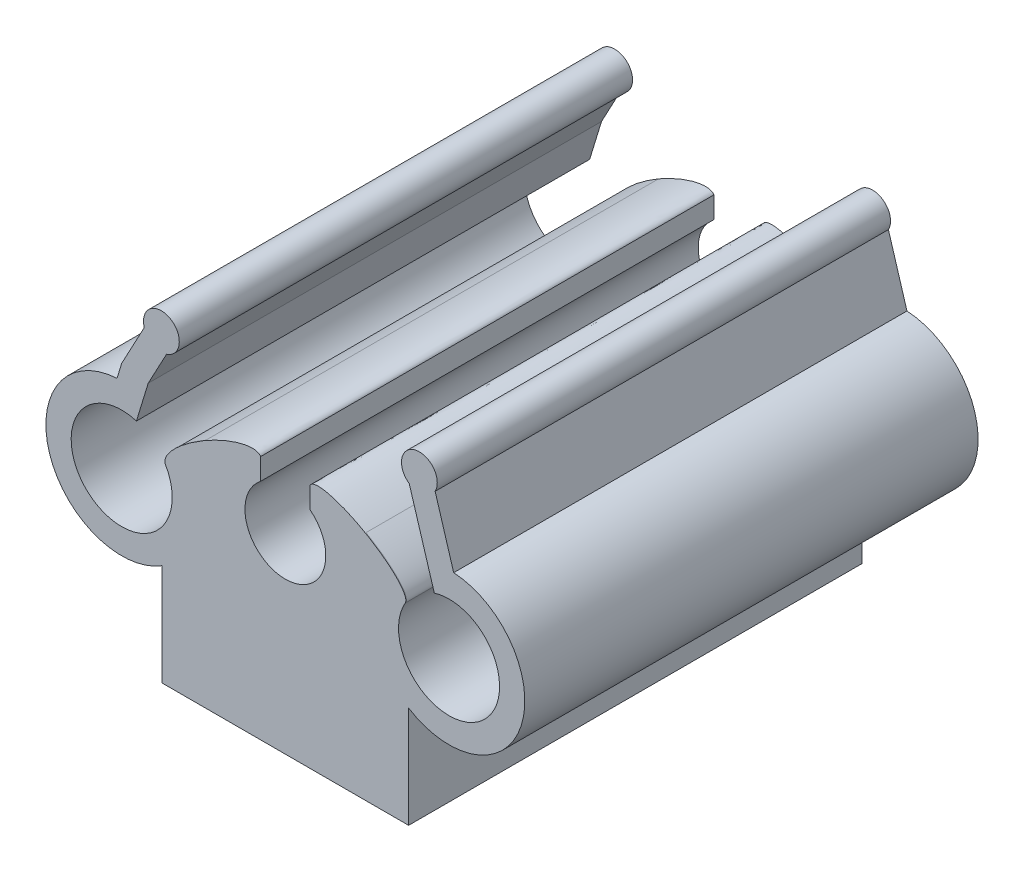
ISO-10303-21;
HEADER;
FILE_DESCRIPTION(('STEP AP214'),'2;1');
FILE_NAME('part.step','',(''),(''),'','','');
FILE_SCHEMA(('AUTOMOTIVE_DESIGN { 1 0 10303 214 1 1 1 1 }'));
ENDSEC;
DATA;
#1=APPLICATION_CONTEXT('core data for automotive mechanical design processes');
#2=APPLICATION_PROTOCOL_DEFINITION('international standard','automotive_design',2000,#1);
#3=PRODUCT_CONTEXT('',#1,'mechanical');
#4=PRODUCT('Part','Part','',(#3));
#5=PRODUCT_RELATED_PRODUCT_CATEGORY('part','',(#4));
#6=PRODUCT_DEFINITION_FORMATION('','',#4);
#7=PRODUCT_DEFINITION_CONTEXT('part definition',#1,'design');
#8=PRODUCT_DEFINITION('design','',#6,#7);
#9=PRODUCT_DEFINITION_SHAPE('','',#8);
#10=(LENGTH_UNIT() NAMED_UNIT(*) SI_UNIT(.MILLI.,.METRE.));
#11=(NAMED_UNIT(*) PLANE_ANGLE_UNIT() SI_UNIT($,.RADIAN.));
#12=(NAMED_UNIT(*) SI_UNIT($,.STERADIAN.) SOLID_ANGLE_UNIT());
#13=UNCERTAINTY_MEASURE_WITH_UNIT(LENGTH_MEASURE(1.E-05),#10,'distance_accuracy_value','');
#14=(GEOMETRIC_REPRESENTATION_CONTEXT(3) GLOBAL_UNCERTAINTY_ASSIGNED_CONTEXT((#13)) GLOBAL_UNIT_ASSIGNED_CONTEXT((#10,
#11,#12)) REPRESENTATION_CONTEXT('',''));
#15=CARTESIAN_POINT('',(0.,0.,0.));
#16=DIRECTION('',(0.,0.,1.));
#17=DIRECTION('',(1.,0.,0.));
#18=AXIS2_PLACEMENT_3D('',#15,#16,#17);
#19=CARTESIAN_POINT('',(0.,0.,0.));
#20=DIRECTION('',(0.,0.,1.));
#21=DIRECTION('',(1.,0.,0.));
#22=AXIS2_PLACEMENT_3D('',#19,#20,#21);
#23=PLANE('',#22);
#24=DIRECTION('',(0.291731736972822,-0.95650017963554,0.));
#25=VECTOR('',#24,1.);
#26=CARTESIAN_POINT('',(15.2796147920512,4.66026944737135,0.));
#27=LINE('',#26,#25);
#28=CARTESIAN_POINT('',(12.229508337958,14.6606465113157,0.));
#29=VERTEX_POINT('',#28);
#30=CARTESIAN_POINT('',(13.4706706575679,10.5912504490889,0.));
#31=VERTEX_POINT('',#30);
#32=EDGE_CURVE('E218',#29,#31,#27,.T.);
#33=ORIENTED_EDGE('',*,*,#32,.F.);
#34=CARTESIAN_POINT('',(12.7313923020308,15.3895755110176,0.));
#35=DIRECTION('',(0.,0.,-1.));
#36=DIRECTION('',(-1.,0.,0.));
#37=AXIS2_PLACEMENT_3D('',#34,#35,#36);
#38=CIRCLE('',#37,0.885);
#39=CARTESIAN_POINT('',(13.5113140624497,14.9713087927324,0.));
#40=VERTEX_POINT('',#39);
#41=EDGE_CURVE('E201',#29,#40,#38,.T.);
#42=ORIENTED_EDGE('',*,*,#41,.T.);
#43=DIRECTION('',(-0.290165819582983,0.956976382752331,0.));
#44=VECTOR('',#43,1.);
#45=CARTESIAN_POINT('',(17.5581669168622,1.62465544909494,0.));
#46=LINE('',#45,#44);
#47=CARTESIAN_POINT('',(14.4295404010518,11.9429682344745,0.));
#48=VERTEX_POINT('',#47);
#49=EDGE_CURVE('E213',#48,#40,#46,.T.);
#50=ORIENTED_EDGE('',*,*,#49,.F.);
#51=CARTESIAN_POINT('',(14.2,8.2,0.));
#52=DIRECTION('',(0.,0.,1.));
#53=DIRECTION('',(-1.,0.,0.));
#54=AXIS2_PLACEMENT_3D('',#51,#52,#53);
#55=CIRCLE('',#54,3.75);
#56=CARTESIAN_POINT('',(12.2,5.02785561488762,0.));
#57=VERTEX_POINT('',#56);
#58=EDGE_CURVE('E527',#57,#48,#55,.T.);
#59=ORIENTED_EDGE('',*,*,#58,.F.);
#60=DIRECTION('',(0.,1.,0.));
#61=VECTOR('',#60,1.);
#62=CARTESIAN_POINT('',(12.2,0.,0.));
#63=LINE('',#62,#61);
#64=CARTESIAN_POINT('',(12.2,0.,0.));
#65=VERTEX_POINT('',#64);
#66=EDGE_CURVE('E228',#65,#57,#63,.T.);
#67=ORIENTED_EDGE('',*,*,#66,.F.);
#68=DIRECTION('',(1.,0.,0.));
#69=VECTOR('',#68,1.);
#70=CARTESIAN_POINT('',(0.,0.,0.));
#71=LINE('',#70,#69);
#72=CARTESIAN_POINT('',(0.,0.,0.));
#73=VERTEX_POINT('',#72);
#74=EDGE_CURVE('E234',#73,#65,#71,.T.);
#75=ORIENTED_EDGE('',*,*,#74,.F.);
#76=DIRECTION('',(0.,1.,0.));
#77=VECTOR('',#76,1.);
#78=CARTESIAN_POINT('',(0.,0.,0.));
#79=LINE('',#78,#77);
#80=CARTESIAN_POINT('',(0.,5.02785561488762,0.));
#81=VERTEX_POINT('',#80);
#82=EDGE_CURVE('E329',#73,#81,#79,.T.);
#83=ORIENTED_EDGE('',*,*,#82,.T.);
#84=CARTESIAN_POINT('',(-2.,8.2,0.));
#85=DIRECTION('',(0.,0.,1.));
#86=DIRECTION('',(1.,0.,0.));
#87=AXIS2_PLACEMENT_3D('',#84,#85,#86);
#88=CIRCLE('',#87,3.75);
#89=CARTESIAN_POINT('',(-2.22954040105179,11.9429682344745,0.));
#90=VERTEX_POINT('',#89);
#91=EDGE_CURVE('E538',#90,#81,#88,.T.);
#92=ORIENTED_EDGE('',*,*,#91,.F.);
#93=DIRECTION('',(-0.290165819582982,-0.956976382752331,0.));
#94=VECTOR('',#93,1.);
#95=CARTESIAN_POINT('',(-2.,12.7,0.));
#96=LINE('',#95,#94);
#97=CARTESIAN_POINT('',(-2.,12.7,0.));
#98=VERTEX_POINT('',#97);
#99=EDGE_CURVE('E532',#98,#90,#96,.T.);
#100=ORIENTED_EDGE('',*,*,#99,.F.);
#101=DIRECTION('',(0.471506270953642,0.881862708391386,0.));
#102=VECTOR('',#101,1.);
#103=CARTESIAN_POINT('',(-4.12379030111886,8.72785459626649,0.));
#104=LINE('',#103,#102);
#105=CARTESIAN_POINT('',(-0.880916647111612,14.7930323460977,0.));
#106=VERTEX_POINT('',#105);
#107=EDGE_CURVE('E366',#98,#106,#104,.T.);
#108=ORIENTED_EDGE('',*,*,#107,.T.);
#109=CARTESIAN_POINT('',(-0.0343169943944621,15.0508967058281,0.));
#110=DIRECTION('',(0.,0.,-1.));
#111=DIRECTION('',(-1.,0.,0.));
#112=AXIS2_PLACEMENT_3D('',#109,#110,#111);
#113=CIRCLE('',#112,0.885000000000001);
#114=CARTESIAN_POINT('',(0.221411738377617,14.2036495074056,0.));
#115=VERTEX_POINT('',#114);
#116=EDGE_CURVE('E362',#106,#115,#113,.T.);
#117=ORIENTED_EDGE('',*,*,#116,.T.);
#118=DIRECTION('',(-0.471506270953643,-0.881862708391386,0.));
#119=VECTOR('',#118,1.);
#120=CARTESIAN_POINT('',(-3.02146191562963,8.13847175757446,0.));
#121=LINE('',#120,#119);
#122=CARTESIAN_POINT('',(-0.6872071836223,12.5042508083599,0.));
#123=VERTEX_POINT('',#122);
#124=EDGE_CURVE('E358',#115,#123,#121,.T.);
#125=ORIENTED_EDGE('',*,*,#124,.T.);
#126=DIRECTION('',(-0.291731736972822,-0.95650017963554,0.));
#127=VECTOR('',#126,1.);
#128=CARTESIAN_POINT('',(-3.07961479205117,4.66026944737135,0.));
#129=LINE('',#128,#127);
#130=CARTESIAN_POINT('',(-1.27067065756795,10.5912504490889,0.));
#131=VERTEX_POINT('',#130);
#132=EDGE_CURVE('E353',#123,#131,#129,.T.);
#133=ORIENTED_EDGE('',*,*,#132,.T.);
#134=CARTESIAN_POINT('',(-2.,8.2,0.));
#135=DIRECTION('',(0.,0.,-1.));
#136=DIRECTION('',(-1.,0.,0.));
#137=AXIS2_PLACEMENT_3D('',#134,#135,#136);
#138=CIRCLE('',#137,2.5);
#139=CARTESIAN_POINT('',(0.168783166431,9.44353511289611,0.));
#140=VERTEX_POINT('',#139);
#141=EDGE_CURVE('E349',#140,#131,#138,.T.);
#142=ORIENTED_EDGE('',*,*,#141,.F.);
#143=CARTESIAN_POINT('',(2.64119597616234,10.8611651415977,0.));
#144=DIRECTION('',(0.,0.,1.));
#145=DIRECTION('',(0.867513266572399,0.497414045158443,0.));
#146=AXIS2_PLACEMENT_3D('',#143,#144,#145);
#147=ELLIPSE('',#146,2.85,0.772022221071091);
#148=CARTESIAN_POINT('',(2.13832423144809,11.4617178164325,0.));
#149=VERTEX_POINT('',#148);
#150=EDGE_CURVE('E432',#149,#140,#147,.T.);
#151=ORIENTED_EDGE('',*,*,#150,.F.);
#152=CARTESIAN_POINT('',(2.5218915832155,10.7927584866363,0.));
#153=DIRECTION('',(0.,0.,-1.));
#154=DIRECTION('',(-0.867513266572398,-0.497414045158445,0.));
#155=AXIS2_PLACEMENT_3D('',#152,#153,#154);
#156=ELLIPSE('',#155,2.71247542539814,0.771122881428907);
#157=CARTESIAN_POINT('',(4.875,12.1419818603764,0.));
#158=VERTEX_POINT('',#157);
#159=EDGE_CURVE('E542',#149,#158,#156,.T.);
#160=ORIENTED_EDGE('',*,*,#159,.T.);
#161=DIRECTION('',(0.,-1.,0.));
#162=VECTOR('',#161,1.);
#163=CARTESIAN_POINT('',(4.875,13.1475773492291,0.));
#164=LINE('',#163,#162);
#165=CARTESIAN_POINT('',(4.875,11.0809411753762,0.));
#166=VERTEX_POINT('',#165);
#167=EDGE_CURVE('E495',#158,#166,#164,.T.);
#168=ORIENTED_EDGE('',*,*,#167,.T.);
#169=CARTESIAN_POINT('',(6.1,9.5,0.));
#170=DIRECTION('',(0.,0.,1.));
#171=DIRECTION('',(1.,0.,0.));
#172=AXIS2_PLACEMENT_3D('',#169,#170,#171);
#173=CIRCLE('',#172,2.);
#174=CARTESIAN_POINT('',(7.325,11.0809411753762,0.));
#175=VERTEX_POINT('',#174);
#176=EDGE_CURVE('E252',#166,#175,#173,.T.);
#177=ORIENTED_EDGE('',*,*,#176,.T.);
#178=DIRECTION('',(0.,1.,0.));
#179=VECTOR('',#178,1.);
#180=CARTESIAN_POINT('',(7.325,13.1475773492291,0.));
#181=LINE('',#180,#179);
#182=CARTESIAN_POINT('',(7.325,12.1419818603764,0.));
#183=VERTEX_POINT('',#182);
#184=EDGE_CURVE('E397',#175,#183,#181,.T.);
#185=ORIENTED_EDGE('',*,*,#184,.T.);
#186=CARTESIAN_POINT('',(9.6781084167845,10.7927584866363,0.));
#187=DIRECTION('',(0.,0.,-1.));
#188=DIRECTION('',(0.867513266572398,-0.497414045158445,0.));
#189=AXIS2_PLACEMENT_3D('',#186,#187,#188);
#190=ELLIPSE('',#189,2.71247542539814,0.771122881428907);
#191=CARTESIAN_POINT('',(10.0616757685519,11.4617178164324,0.));
#192=VERTEX_POINT('',#191);
#193=EDGE_CURVE('E69',#183,#192,#190,.T.);
#194=ORIENTED_EDGE('',*,*,#193,.T.);
#195=CARTESIAN_POINT('',(9.55880402383766,10.8611651415977,0.));
#196=DIRECTION('',(0.,0.,-1.));
#197=DIRECTION('',(-0.867513266572399,0.497414045158443,0.));
#198=AXIS2_PLACEMENT_3D('',#195,#196,#197);
#199=ELLIPSE('',#198,2.85,0.772022221071091);
#200=CARTESIAN_POINT('',(12.031216833569,9.44353511289611,0.));
#201=VERTEX_POINT('',#200);
#202=EDGE_CURVE('E253',#192,#201,#199,.T.);
#203=ORIENTED_EDGE('',*,*,#202,.T.);
#204=CARTESIAN_POINT('',(14.2,8.2,0.));
#205=DIRECTION('',(0.,0.,1.));
#206=DIRECTION('',(1.,0.,0.));
#207=AXIS2_PLACEMENT_3D('',#204,#205,#206);
#208=CIRCLE('',#207,2.5);
#209=EDGE_CURVE('E225',#201,#31,#208,.T.);
#210=ORIENTED_EDGE('',*,*,#209,.T.);
#211=EDGE_LOOP('',(#33,#42,#50,#59,#67,#75,#83,#92,#100,#108,#117,#125,#133,#142,#151,#160,#168,
#177,#185,#194,#203,#210));
#212=FACE_BOUND('',#211,.T.);
#213=ADVANCED_FACE('F45',(#212),#23,.F.);
#214=CARTESIAN_POINT('',(6.1,9.5,22.43));
#215=DIRECTION('',(0.,0.,-1.));
#216=DIRECTION('',(-1.,0.,0.));
#217=AXIS2_PLACEMENT_3D('',#214,#215,#216);
#218=CYLINDRICAL_SURFACE('',#217,2.);
#219=ORIENTED_EDGE('',*,*,#176,.F.);
#220=DIRECTION('',(0.,0.,-1.));
#221=VECTOR('',#220,1.);
#222=CARTESIAN_POINT('',(4.875,11.0809411753762,22.5));
#223=LINE('',#222,#221);
#224=CARTESIAN_POINT('',(4.875,11.0809411753762,22.43));
#225=VERTEX_POINT('',#224);
#226=EDGE_CURVE('E418',#225,#166,#223,.T.);
#227=ORIENTED_EDGE('',*,*,#226,.F.);
#228=CARTESIAN_POINT('',(6.1,9.5,22.43));
#229=DIRECTION('',(0.,0.,1.));
#230=DIRECTION('',(1.,0.,0.));
#231=AXIS2_PLACEMENT_3D('',#228,#229,#230);
#232=CIRCLE('',#231,2.);
#233=CARTESIAN_POINT('',(7.325,11.0809411753762,22.43));
#234=VERTEX_POINT('',#233);
#235=EDGE_CURVE('E232',#225,#234,#232,.T.);
#236=ORIENTED_EDGE('',*,*,#235,.T.);
#237=DIRECTION('',(0.,0.,-1.));
#238=VECTOR('',#237,1.);
#239=CARTESIAN_POINT('',(7.325,11.0809411753762,22.5));
#240=LINE('',#239,#238);
#241=EDGE_CURVE('E415',#234,#175,#240,.T.);
#242=ORIENTED_EDGE('',*,*,#241,.T.);
#243=EDGE_LOOP('',(#219,#227,#236,#242));
#244=FACE_BOUND('',#243,.T.);
#245=ADVANCED_FACE('F47',(#244),#218,.F.);
#246=CARTESIAN_POINT('',(0.,0.,22.43));
#247=DIRECTION('',(0.,0.,1.));
#248=DIRECTION('',(1.,0.,0.));
#249=AXIS2_PLACEMENT_3D('',#246,#247,#248);
#250=PLANE('',#249);
#251=CARTESIAN_POINT('',(12.7313923020308,15.3895755110176,22.43));
#252=DIRECTION('',(0.,0.,-1.));
#253=DIRECTION('',(-1.,0.,0.));
#254=AXIS2_PLACEMENT_3D('',#251,#252,#253);
#255=CIRCLE('',#254,0.885);
#256=CARTESIAN_POINT('',(12.229508337958,14.6606465113157,22.43));
#257=VERTEX_POINT('',#256);
#258=CARTESIAN_POINT('',(13.5113140624497,14.9713087927324,22.43));
#259=VERTEX_POINT('',#258);
#260=EDGE_CURVE('E61',#257,#259,#255,.T.);
#261=ORIENTED_EDGE('',*,*,#260,.F.);
#262=DIRECTION('',(0.291731736972822,-0.95650017963554,0.));
#263=VECTOR('',#262,1.);
#264=CARTESIAN_POINT('',(15.2796147920512,4.66026944737135,22.43));
#265=LINE('',#264,#263);
#266=CARTESIAN_POINT('',(13.4706706575679,10.5912504490889,22.43));
#267=VERTEX_POINT('',#266);
#268=EDGE_CURVE('E220',#257,#267,#265,.T.);
#269=ORIENTED_EDGE('',*,*,#268,.T.);
#270=CARTESIAN_POINT('',(14.2,8.2,22.43));
#271=DIRECTION('',(0.,0.,1.));
#272=DIRECTION('',(1.,0.,0.));
#273=AXIS2_PLACEMENT_3D('',#270,#271,#272);
#274=CIRCLE('',#273,2.5);
#275=CARTESIAN_POINT('',(12.031216833569,9.44353511289611,22.43));
#276=VERTEX_POINT('',#275);
#277=EDGE_CURVE('E246',#276,#267,#274,.T.);
#278=ORIENTED_EDGE('',*,*,#277,.F.);
#279=CARTESIAN_POINT('',(9.6781084167845,10.7927584866363,22.43));
#280=DIRECTION('',(0.,0.,1.));
#281=DIRECTION('',(0.867513266572398,-0.497414045158445,0.));
#282=AXIS2_PLACEMENT_3D('',#279,#280,#281);
#283=ELLIPSE('',#282,2.71247542539814,0.771122881428907);
#284=CARTESIAN_POINT('',(7.325,12.1419818603764,22.43));
#285=VERTEX_POINT('',#284);
#286=EDGE_CURVE('E261',#276,#285,#283,.T.);
#287=ORIENTED_EDGE('',*,*,#286,.T.);
#288=DIRECTION('',(0.,-1.,0.));
#289=VECTOR('',#288,1.);
#290=CARTESIAN_POINT('',(7.325,0.,22.43));
#291=LINE('',#290,#289);
#292=EDGE_CURVE('E408',#285,#234,#291,.T.);
#293=ORIENTED_EDGE('',*,*,#292,.T.);
#294=ORIENTED_EDGE('',*,*,#235,.F.);
#295=DIRECTION('',(0.,1.,0.));
#296=VECTOR('',#295,1.);
#297=CARTESIAN_POINT('',(4.875,0.,22.43));
#298=LINE('',#297,#296);
#299=CARTESIAN_POINT('',(4.875,12.1419818603764,22.43));
#300=VERTEX_POINT('',#299);
#301=EDGE_CURVE('E423',#225,#300,#298,.T.);
#302=ORIENTED_EDGE('',*,*,#301,.T.);
#303=CARTESIAN_POINT('',(2.5218915832155,10.7927584866363,22.43));
#304=DIRECTION('',(0.,0.,-1.));
#305=DIRECTION('',(-0.867513266572398,-0.497414045158445,0.));
#306=AXIS2_PLACEMENT_3D('',#303,#304,#305);
#307=ELLIPSE('',#306,2.71247542539814,0.771122881428907);
#308=CARTESIAN_POINT('',(0.168783166431,9.44353511289611,22.43));
#309=VERTEX_POINT('',#308);
#310=EDGE_CURVE('E486',#309,#300,#307,.T.);
#311=ORIENTED_EDGE('',*,*,#310,.F.);
#312=CARTESIAN_POINT('',(-2.,8.2,22.43));
#313=DIRECTION('',(0.,0.,-1.));
#314=DIRECTION('',(-1.,0.,0.));
#315=AXIS2_PLACEMENT_3D('',#312,#313,#314);
#316=CIRCLE('',#315,2.5);
#317=CARTESIAN_POINT('',(-1.27067065756795,10.5912504490889,22.43));
#318=VERTEX_POINT('',#317);
#319=EDGE_CURVE('E212',#309,#318,#316,.T.);
#320=ORIENTED_EDGE('',*,*,#319,.T.);
#321=DIRECTION('',(-0.291731736972822,-0.95650017963554,0.));
#322=VECTOR('',#321,1.);
#323=CARTESIAN_POINT('',(-3.07961479205117,4.66026944737135,22.43));
#324=LINE('',#323,#322);
#325=CARTESIAN_POINT('',(-0.6872071836223,12.5042508083599,22.43));
#326=VERTEX_POINT('',#325);
#327=EDGE_CURVE('E563',#326,#318,#324,.T.);
#328=ORIENTED_EDGE('',*,*,#327,.F.);
#329=DIRECTION('',(-0.471506270953643,-0.881862708391386,0.));
#330=VECTOR('',#329,1.);
#331=CARTESIAN_POINT('',(-3.02146191562963,8.13847175757446,22.43));
#332=LINE('',#331,#330);
#333=CARTESIAN_POINT('',(0.221411738377617,14.2036495074056,22.43));
#334=VERTEX_POINT('',#333);
#335=EDGE_CURVE('E560',#334,#326,#332,.T.);
#336=ORIENTED_EDGE('',*,*,#335,.F.);
#337=CARTESIAN_POINT('',(-0.0343169943944621,15.0508967058281,22.43));
#338=DIRECTION('',(0.,0.,-1.));
#339=DIRECTION('',(-1.,0.,0.));
#340=AXIS2_PLACEMENT_3D('',#337,#338,#339);
#341=CIRCLE('',#340,0.885000000000001);
#342=CARTESIAN_POINT('',(-0.880916647111612,14.7930323460977,22.43));
#343=VERTEX_POINT('',#342);
#344=EDGE_CURVE('E343',#343,#334,#341,.T.);
#345=ORIENTED_EDGE('',*,*,#344,.F.);
#346=DIRECTION('',(0.471506270953642,0.881862708391386,0.));
#347=VECTOR('',#346,1.);
#348=CARTESIAN_POINT('',(-4.12379030111886,8.72785459626649,22.43));
#349=LINE('',#348,#347);
#350=CARTESIAN_POINT('',(-2.,12.7,22.43));
#351=VERTEX_POINT('',#350);
#352=EDGE_CURVE('E337',#351,#343,#349,.T.);
#353=ORIENTED_EDGE('',*,*,#352,.F.);
#354=DIRECTION('',(0.290165819582982,0.956976382752331,0.));
#355=VECTOR('',#354,1.);
#356=CARTESIAN_POINT('',(-5.35816691686215,1.62465544909493,22.43));
#357=LINE('',#356,#355);
#358=CARTESIAN_POINT('',(-2.22954040105179,11.9429682344745,22.43));
#359=VERTEX_POINT('',#358);
#360=EDGE_CURVE('E487',#359,#351,#357,.T.);
#361=ORIENTED_EDGE('',*,*,#360,.F.);
#362=CARTESIAN_POINT('',(-2.,8.2,22.43));
#363=DIRECTION('',(0.,0.,1.));
#364=DIRECTION('',(1.,0.,0.));
#365=AXIS2_PLACEMENT_3D('',#362,#363,#364);
#366=CIRCLE('',#365,3.75);
#367=CARTESIAN_POINT('',(0.,5.02785561488762,22.43));
#368=VERTEX_POINT('',#367);
#369=EDGE_CURVE('E54',#368,#359,#366,.F.);
#370=ORIENTED_EDGE('',*,*,#369,.F.);
#371=DIRECTION('',(0.,1.,0.));
#372=VECTOR('',#371,1.);
#373=CARTESIAN_POINT('',(0.,0.,22.43));
#374=LINE('',#373,#372);
#375=CARTESIAN_POINT('',(0.,0.,22.43));
#376=VERTEX_POINT('',#375);
#377=EDGE_CURVE('E327',#376,#368,#374,.T.);
#378=ORIENTED_EDGE('',*,*,#377,.F.);
#379=DIRECTION('',(1.,0.,0.));
#380=VECTOR('',#379,1.);
#381=CARTESIAN_POINT('',(0.,0.,22.43));
#382=LINE('',#381,#380);
#383=CARTESIAN_POINT('',(12.2,0.,22.43));
#384=VERTEX_POINT('',#383);
#385=EDGE_CURVE('E314',#376,#384,#382,.T.);
#386=ORIENTED_EDGE('',*,*,#385,.T.);
#387=DIRECTION('',(0.,1.,0.));
#388=VECTOR('',#387,1.);
#389=CARTESIAN_POINT('',(12.2,0.,22.43));
#390=LINE('',#389,#388);
#391=CARTESIAN_POINT('',(12.2,5.02785561488762,22.43));
#392=VERTEX_POINT('',#391);
#393=EDGE_CURVE('E322',#384,#392,#390,.T.);
#394=ORIENTED_EDGE('',*,*,#393,.T.);
#395=CARTESIAN_POINT('',(14.2,8.2,22.43));
#396=DIRECTION('',(0.,0.,1.));
#397=DIRECTION('',(1.,0.,0.));
#398=AXIS2_PLACEMENT_3D('',#395,#396,#397);
#399=CIRCLE('',#398,3.75);
#400=CARTESIAN_POINT('',(14.4295404010518,11.9429682344745,22.43));
#401=VERTEX_POINT('',#400);
#402=EDGE_CURVE('E11',#401,#392,#399,.F.);
#403=ORIENTED_EDGE('',*,*,#402,.F.);
#404=DIRECTION('',(-0.290165819582983,0.956976382752331,0.));
#405=VECTOR('',#404,1.);
#406=CARTESIAN_POINT('',(17.5581669168622,1.62465544909494,22.43));
#407=LINE('',#406,#405);
#408=EDGE_CURVE('E336',#401,#259,#407,.T.);
#409=ORIENTED_EDGE('',*,*,#408,.T.);
#410=EDGE_LOOP('',(#261,#269,#278,#287,#293,#294,#302,#311,#320,#328,#336,#345,#353,#361,#370,
#378,#386,#394,#403,#409));
#411=FACE_BOUND('',#410,.T.);
#412=ADVANCED_FACE('F292',(#411),#250,.T.);
#413=CARTESIAN_POINT('',(2.64119597616234,10.8611651415977,22.4));
#414=DIRECTION('',(0.,0.,1.));
#415=DIRECTION('',(0.867513266572399,0.497414045158443,0.));
#416=AXIS2_PLACEMENT_3D('',#413,#414,#415);
#417=ELLIPSE('',#416,2.85,0.772022221071091);
#418=DIRECTION('',(0.,0.,-1.));
#419=VECTOR('',#418,1.);
#420=SURFACE_OF_LINEAR_EXTRUSION('',#417,#419);
#421=CARTESIAN_POINT('',(2.64119597616234,10.8611651415977,22.4));
#422=DIRECTION('',(0.,0.,1.));
#423=DIRECTION('',(0.867513266572399,0.497414045158443,0.));
#424=AXIS2_PLACEMENT_3D('',#421,#422,#423);
#425=ELLIPSE('',#424,2.85,0.772022221071091);
#426=CARTESIAN_POINT('',(2.13832423144809,11.4617178164325,22.4));
#427=VERTEX_POINT('',#426);
#428=CARTESIAN_POINT('',(0.168783166431,9.44353511289611,22.4));
#429=VERTEX_POINT('',#428);
#430=EDGE_CURVE('E498',#427,#429,#425,.T.);
#431=ORIENTED_EDGE('',*,*,#430,.F.);
#432=DIRECTION('',(0.,0.,1.));
#433=VECTOR('',#432,1.);
#434=CARTESIAN_POINT('',(2.13832423144809,11.4617178164325,-2.6));
#435=LINE('',#434,#433);
#436=EDGE_CURVE('E222',#149,#427,#435,.T.);
#437=ORIENTED_EDGE('',*,*,#436,.F.);
#438=ORIENTED_EDGE('',*,*,#150,.T.);
#439=DIRECTION('',(0.,0.,-1.));
#440=VECTOR('',#439,1.);
#441=CARTESIAN_POINT('',(0.168783166431,9.44353511289611,22.4));
#442=LINE('',#441,#440);
#443=EDGE_CURVE('E354',#429,#140,#442,.T.);
#444=ORIENTED_EDGE('',*,*,#443,.F.);
#445=EDGE_LOOP('',(#431,#437,#438,#444));
#446=FACE_BOUND('',#445,.T.);
#447=ADVANCED_FACE('F295',(#446),#420,.F.);
#448=DIRECTION('',(0.,0.,-1.));
#449=VECTOR('',#448,1.);
#450=SURFACE_OF_LINEAR_EXTRUSION('',#283,#449);
#451=ORIENTED_EDGE('',*,*,#193,.F.);
#452=DIRECTION('',(0.,0.,-1.));
#453=VECTOR('',#452,1.);
#454=CARTESIAN_POINT('',(7.325,12.1419818603764,22.43));
#455=LINE('',#454,#453);
#456=EDGE_CURVE('E260',#285,#183,#455,.T.);
#457=ORIENTED_EDGE('',*,*,#456,.F.);
#458=ORIENTED_EDGE('',*,*,#286,.F.);
#459=DIRECTION('',(0.,0.,-1.));
#460=VECTOR('',#459,1.);
#461=CARTESIAN_POINT('',(12.031216833569,9.44353511289611,22.43));
#462=LINE('',#461,#460);
#463=CARTESIAN_POINT('',(12.031216833569,9.44353511289611,22.4));
#464=VERTEX_POINT('',#463);
#465=EDGE_CURVE('E243',#276,#464,#462,.T.);
#466=ORIENTED_EDGE('',*,*,#465,.T.);
#467=CARTESIAN_POINT('',(9.6781084167845,10.7927584866363,22.4));
#468=DIRECTION('',(0.,0.,1.));
#469=DIRECTION('',(0.867513266572398,-0.497414045158445,0.));
#470=AXIS2_PLACEMENT_3D('',#467,#468,#469);
#471=ELLIPSE('',#470,2.71247542539814,0.771122881428907);
#472=CARTESIAN_POINT('',(10.0616757685519,11.4617178164324,22.4));
#473=VERTEX_POINT('',#472);
#474=EDGE_CURVE('E264',#464,#473,#471,.T.);
#475=ORIENTED_EDGE('',*,*,#474,.T.);
#476=DIRECTION('',(0.,0.,1.));
#477=VECTOR('',#476,1.);
#478=CARTESIAN_POINT('',(10.0616757685519,11.4617178164324,-2.6));
#479=LINE('',#478,#477);
#480=EDGE_CURVE('E391',#192,#473,#479,.T.);
#481=ORIENTED_EDGE('',*,*,#480,.F.);
#482=EDGE_LOOP('',(#451,#457,#458,#466,#475,#481));
#483=FACE_BOUND('',#482,.T.);
#484=ADVANCED_FACE('F290',(#483),#450,.F.);
#485=CARTESIAN_POINT('',(0.,0.,22.43));
#486=DIRECTION('',(0.,1.,0.));
#487=DIRECTION('',(0.,0.,1.));
#488=AXIS2_PLACEMENT_3D('',#485,#486,#487);
#489=PLANE('',#488);
#490=ORIENTED_EDGE('',*,*,#385,.F.);
#491=DIRECTION('',(0.,0.,-1.));
#492=VECTOR('',#491,1.);
#493=CARTESIAN_POINT('',(0.,0.,22.43));
#494=LINE('',#493,#492);
#495=EDGE_CURVE('E316',#376,#73,#494,.T.);
#496=ORIENTED_EDGE('',*,*,#495,.T.);
#497=ORIENTED_EDGE('',*,*,#74,.T.);
#498=DIRECTION('',(0.,0.,-1.));
#499=VECTOR('',#498,1.);
#500=CARTESIAN_POINT('',(12.2,0.,22.43));
#501=LINE('',#500,#499);
#502=EDGE_CURVE('E247',#384,#65,#501,.T.);
#503=ORIENTED_EDGE('',*,*,#502,.F.);
#504=EDGE_LOOP('',(#490,#496,#497,#503));
#505=FACE_BOUND('',#504,.T.);
#506=ADVANCED_FACE('F305',(#505),#489,.F.);
#507=CARTESIAN_POINT('',(12.2,0.,22.43));
#508=DIRECTION('',(-1.,0.,0.));
#509=DIRECTION('',(0.,0.,1.));
#510=AXIS2_PLACEMENT_3D('',#507,#508,#509);
#511=PLANE('',#510);
#512=ORIENTED_EDGE('',*,*,#66,.T.);
#513=DIRECTION('',(0.,0.,-1.));
#514=VECTOR('',#513,1.);
#515=CARTESIAN_POINT('',(12.2,5.02785561488762,25.));
#516=LINE('',#515,#514);
#517=EDGE_CURVE('E522',#392,#57,#516,.T.);
#518=ORIENTED_EDGE('',*,*,#517,.F.);
#519=ORIENTED_EDGE('',*,*,#393,.F.);
#520=ORIENTED_EDGE('',*,*,#502,.T.);
#521=EDGE_LOOP('',(#512,#518,#519,#520));
#522=FACE_BOUND('',#521,.T.);
#523=ADVANCED_FACE('F303',(#522),#511,.F.);
#524=CARTESIAN_POINT('',(15.2796147920512,4.66026944737135,22.43));
#525=DIRECTION('',(0.95650017963554,0.291731736972822,0.));
#526=DIRECTION('',(-0.291731736972822,0.95650017963554,0.));
#527=AXIS2_PLACEMENT_3D('',#524,#525,#526);
#528=PLANE('',#527);
#529=ORIENTED_EDGE('',*,*,#268,.F.);
#530=DIRECTION('',(0.,0.,1.));
#531=VECTOR('',#530,1.);
#532=CARTESIAN_POINT('',(12.229508337958,14.6606465113157,0.));
#533=LINE('',#532,#531);
#534=EDGE_CURVE('E204',#257,#29,#533,.F.);
#535=ORIENTED_EDGE('',*,*,#534,.T.);
#536=ORIENTED_EDGE('',*,*,#32,.T.);
#537=DIRECTION('',(0.,0.,-1.));
#538=VECTOR('',#537,1.);
#539=CARTESIAN_POINT('',(13.4706706575679,10.5912504490889,22.43));
#540=LINE('',#539,#538);
#541=EDGE_CURVE('E240',#267,#31,#540,.T.);
#542=ORIENTED_EDGE('',*,*,#541,.F.);
#543=EDGE_LOOP('',(#529,#535,#536,#542));
#544=FACE_BOUND('',#543,.T.);
#545=ADVANCED_FACE('F216',(#544),#528,.F.);
#546=CARTESIAN_POINT('',(14.2,8.2,22.43));
#547=DIRECTION('',(0.,0.,-1.));
#548=DIRECTION('',(-1.,0.,0.));
#549=AXIS2_PLACEMENT_3D('',#546,#547,#548);
#550=CYLINDRICAL_SURFACE('',#549,2.5);
#551=ORIENTED_EDGE('',*,*,#277,.T.);
#552=ORIENTED_EDGE('',*,*,#541,.T.);
#553=ORIENTED_EDGE('',*,*,#209,.F.);
#554=DIRECTION('',(0.,0.,-1.));
#555=VECTOR('',#554,1.);
#556=CARTESIAN_POINT('',(12.031216833569,9.44353511289611,22.4));
#557=LINE('',#556,#555);
#558=EDGE_CURVE('E248',#464,#201,#557,.T.);
#559=ORIENTED_EDGE('',*,*,#558,.F.);
#560=ORIENTED_EDGE('',*,*,#465,.F.);
#561=EDGE_LOOP('',(#551,#552,#553,#559,#560));
#562=FACE_BOUND('',#561,.T.);
#563=ADVANCED_FACE('F288',(#562),#550,.F.);
#564=CARTESIAN_POINT('',(9.55880402383766,10.8611651415977,22.4));
#565=DIRECTION('',(0.,0.,-1.));
#566=DIRECTION('',(-0.867513266572399,0.497414045158443,0.));
#567=AXIS2_PLACEMENT_3D('',#564,#565,#566);
#568=ELLIPSE('',#567,2.85,0.772022221071091);
#569=DIRECTION('',(0.,0.,-1.));
#570=VECTOR('',#569,1.);
#571=SURFACE_OF_LINEAR_EXTRUSION('',#568,#570);
#572=ORIENTED_EDGE('',*,*,#480,.T.);
#573=CARTESIAN_POINT('',(9.55880402383766,10.8611651415977,22.4));
#574=DIRECTION('',(0.,0.,-1.));
#575=DIRECTION('',(-0.867513266572399,0.497414045158443,0.));
#576=AXIS2_PLACEMENT_3D('',#573,#574,#575);
#577=ELLIPSE('',#576,2.85,0.772022221071091);
#578=EDGE_CURVE('E256',#473,#464,#577,.T.);
#579=ORIENTED_EDGE('',*,*,#578,.T.);
#580=ORIENTED_EDGE('',*,*,#558,.T.);
#581=ORIENTED_EDGE('',*,*,#202,.F.);
#582=EDGE_LOOP('',(#572,#579,#580,#581));
#583=FACE_BOUND('',#582,.T.);
#584=ADVANCED_FACE('F283',(#583),#571,.T.);
#585=CARTESIAN_POINT('',(9.6781084167845,10.7927584866363,22.4));
#586=DIRECTION('',(0.,0.,1.));
#587=DIRECTION('',(1.,0.,0.));
#588=AXIS2_PLACEMENT_3D('',#585,#586,#587);
#589=PLANE('',#588);
#590=ORIENTED_EDGE('',*,*,#578,.F.);
#591=ORIENTED_EDGE('',*,*,#474,.F.);
#592=EDGE_LOOP('',(#590,#591));
#593=FACE_BOUND('',#592,.T.);
#594=ADVANCED_FACE('F287',(#593),#589,.F.);
#595=CARTESIAN_POINT('',(-2.,8.2,22.43));
#596=DIRECTION('',(0.,0.,-1.));
#597=DIRECTION('',(-1.,0.,0.));
#598=AXIS2_PLACEMENT_3D('',#595,#596,#597);
#599=CYLINDRICAL_SURFACE('',#598,2.5);
#600=ORIENTED_EDGE('',*,*,#141,.T.);
#601=DIRECTION('',(0.,0.,-1.));
#602=VECTOR('',#601,1.);
#603=CARTESIAN_POINT('',(-1.27067065756795,10.5912504490889,22.43));
#604=LINE('',#603,#602);
#605=EDGE_CURVE('E387',#318,#131,#604,.T.);
#606=ORIENTED_EDGE('',*,*,#605,.F.);
#607=ORIENTED_EDGE('',*,*,#319,.F.);
#608=DIRECTION('',(0.,0.,-1.));
#609=VECTOR('',#608,1.);
#610=CARTESIAN_POINT('',(0.168783166431,9.44353511289611,22.43));
#611=LINE('',#610,#609);
#612=EDGE_CURVE('E269',#309,#429,#611,.T.);
#613=ORIENTED_EDGE('',*,*,#612,.T.);
#614=ORIENTED_EDGE('',*,*,#443,.T.);
#615=EDGE_LOOP('',(#600,#606,#607,#613,#614));
#616=FACE_BOUND('',#615,.T.);
#617=ADVANCED_FACE('F466',(#616),#599,.F.);
#618=CARTESIAN_POINT('',(-3.07961479205117,4.66026944737135,22.43));
#619=DIRECTION('',(0.95650017963554,-0.291731736972822,0.));
#620=DIRECTION('',(0.291731736972822,0.95650017963554,0.));
#621=AXIS2_PLACEMENT_3D('',#618,#619,#620);
#622=PLANE('',#621);
#623=ORIENTED_EDGE('',*,*,#132,.F.);
#624=DIRECTION('',(0.,0.,-1.));
#625=VECTOR('',#624,1.);
#626=CARTESIAN_POINT('',(-0.6872071836223,12.5042508083599,22.43));
#627=LINE('',#626,#625);
#628=EDGE_CURVE('E384',#326,#123,#627,.T.);
#629=ORIENTED_EDGE('',*,*,#628,.F.);
#630=ORIENTED_EDGE('',*,*,#327,.T.);
#631=ORIENTED_EDGE('',*,*,#605,.T.);
#632=EDGE_LOOP('',(#623,#629,#630,#631));
#633=FACE_BOUND('',#632,.T.);
#634=ADVANCED_FACE('F462',(#633),#622,.T.);
#635=CARTESIAN_POINT('',(-3.02146191562963,8.13847175757446,22.43));
#636=DIRECTION('',(0.881862708391386,-0.471506270953643,0.));
#637=DIRECTION('',(0.471506270953643,0.881862708391386,0.));
#638=AXIS2_PLACEMENT_3D('',#635,#636,#637);
#639=PLANE('',#638);
#640=ORIENTED_EDGE('',*,*,#124,.F.);
#641=DIRECTION('',(0.,0.,-1.));
#642=VECTOR('',#641,1.);
#643=CARTESIAN_POINT('',(0.221411738377617,14.2036495074056,22.43));
#644=LINE('',#643,#642);
#645=EDGE_CURVE('E381',#334,#115,#644,.T.);
#646=ORIENTED_EDGE('',*,*,#645,.F.);
#647=ORIENTED_EDGE('',*,*,#335,.T.);
#648=ORIENTED_EDGE('',*,*,#628,.T.);
#649=EDGE_LOOP('',(#640,#646,#647,#648));
#650=FACE_BOUND('',#649,.T.);
#651=ADVANCED_FACE('F458',(#650),#639,.T.);
#652=CARTESIAN_POINT('',(-0.0343169943944621,15.0508967058281,22.43));
#653=DIRECTION('',(0.,0.,-1.));
#654=DIRECTION('',(-1.,0.,0.));
#655=AXIS2_PLACEMENT_3D('',#652,#653,#654);
#656=CYLINDRICAL_SURFACE('',#655,0.885000000000001);
#657=ORIENTED_EDGE('',*,*,#116,.F.);
#658=DIRECTION('',(0.,0.,-1.));
#659=VECTOR('',#658,1.);
#660=CARTESIAN_POINT('',(-0.880916647111612,14.7930323460977,22.43));
#661=LINE('',#660,#659);
#662=EDGE_CURVE('E378',#343,#106,#661,.T.);
#663=ORIENTED_EDGE('',*,*,#662,.F.);
#664=ORIENTED_EDGE('',*,*,#344,.T.);
#665=ORIENTED_EDGE('',*,*,#645,.T.);
#666=EDGE_LOOP('',(#657,#663,#664,#665));
#667=FACE_BOUND('',#666,.T.);
#668=ADVANCED_FACE('F454',(#667),#656,.T.);
#669=CARTESIAN_POINT('',(-4.12379030111886,8.72785459626649,22.43));
#670=DIRECTION('',(-0.881862708391386,0.471506270953642,0.));
#671=DIRECTION('',(-0.471506270953642,-0.881862708391386,0.));
#672=AXIS2_PLACEMENT_3D('',#669,#670,#671);
#673=PLANE('',#672);
#674=ORIENTED_EDGE('',*,*,#107,.F.);
#675=DIRECTION('',(0.,0.,-1.));
#676=VECTOR('',#675,1.);
#677=CARTESIAN_POINT('',(-2.,12.7,22.43));
#678=LINE('',#677,#676);
#679=EDGE_CURVE('E331',#351,#98,#678,.T.);
#680=ORIENTED_EDGE('',*,*,#679,.F.);
#681=ORIENTED_EDGE('',*,*,#352,.T.);
#682=ORIENTED_EDGE('',*,*,#662,.T.);
#683=EDGE_LOOP('',(#674,#680,#681,#682));
#684=FACE_BOUND('',#683,.T.);
#685=ADVANCED_FACE('F451',(#684),#673,.T.);
#686=CARTESIAN_POINT('',(0.,0.,22.43));
#687=DIRECTION('',(-1.,0.,0.));
#688=DIRECTION('',(0.,0.,1.));
#689=AXIS2_PLACEMENT_3D('',#686,#687,#688);
#690=PLANE('',#689);
#691=ORIENTED_EDGE('',*,*,#82,.F.);
#692=ORIENTED_EDGE('',*,*,#495,.F.);
#693=ORIENTED_EDGE('',*,*,#377,.T.);
#694=DIRECTION('',(0.,0.,-1.));
#695=VECTOR('',#694,1.);
#696=CARTESIAN_POINT('',(0.,5.02785561488762,25.));
#697=LINE('',#696,#695);
#698=EDGE_CURVE('E539',#368,#81,#697,.T.);
#699=ORIENTED_EDGE('',*,*,#698,.T.);
#700=EDGE_LOOP('',(#691,#692,#693,#699));
#701=FACE_BOUND('',#700,.T.);
#702=ADVANCED_FACE('F325',(#701),#690,.T.);
#703=CARTESIAN_POINT('',(12.7313923020308,15.3895755110176,22.43));
#704=DIRECTION('',(0.,0.,-1.));
#705=DIRECTION('',(-1.,0.,0.));
#706=AXIS2_PLACEMENT_3D('',#703,#704,#705);
#707=CYLINDRICAL_SURFACE('',#706,0.885);
#708=ORIENTED_EDGE('',*,*,#41,.F.);
#709=ORIENTED_EDGE('',*,*,#534,.F.);
#710=ORIENTED_EDGE('',*,*,#260,.T.);
#711=DIRECTION('',(0.,0.,-1.));
#712=VECTOR('',#711,1.);
#713=CARTESIAN_POINT('',(13.5113140624497,14.9713087927324,22.43));
#714=LINE('',#713,#712);
#715=EDGE_CURVE('E207',#259,#40,#714,.T.);
#716=ORIENTED_EDGE('',*,*,#715,.T.);
#717=EDGE_LOOP('',(#708,#709,#710,#716));
#718=FACE_BOUND('',#717,.T.);
#719=ADVANCED_FACE('F203',(#718),#707,.T.);
#720=CARTESIAN_POINT('',(17.5581669168622,1.62465544909494,22.43));
#721=DIRECTION('',(-0.956976382752331,-0.290165819582983,0.));
#722=DIRECTION('',(0.290165819582983,-0.956976382752331,0.));
#723=AXIS2_PLACEMENT_3D('',#720,#721,#722);
#724=PLANE('',#723);
#725=ORIENTED_EDGE('',*,*,#49,.T.);
#726=ORIENTED_EDGE('',*,*,#715,.F.);
#727=ORIENTED_EDGE('',*,*,#408,.F.);
#728=DIRECTION('',(0.,0.,-1.));
#729=VECTOR('',#728,1.);
#730=CARTESIAN_POINT('',(14.4295404010518,11.9429682344745,25.));
#731=LINE('',#730,#729);
#732=EDGE_CURVE('E525',#401,#48,#731,.T.);
#733=ORIENTED_EDGE('',*,*,#732,.T.);
#734=EDGE_LOOP('',(#725,#726,#727,#733));
#735=FACE_BOUND('',#734,.T.);
#736=ADVANCED_FACE('F445',(#735),#724,.F.);
#737=CARTESIAN_POINT('',(7.325,13.1475773492291,22.5));
#738=DIRECTION('',(-1.,0.,0.));
#739=DIRECTION('',(0.,-1.,0.));
#740=AXIS2_PLACEMENT_3D('',#737,#738,#739);
#741=PLANE('',#740);
#742=ORIENTED_EDGE('',*,*,#456,.T.);
#743=ORIENTED_EDGE('',*,*,#184,.F.);
#744=ORIENTED_EDGE('',*,*,#241,.F.);
#745=ORIENTED_EDGE('',*,*,#292,.F.);
#746=EDGE_LOOP('',(#742,#743,#744,#745));
#747=FACE_BOUND('',#746,.T.);
#748=ADVANCED_FACE('F413',(#747),#741,.T.);
#749=CARTESIAN_POINT('',(4.875,13.1475773492291,22.5));
#750=DIRECTION('',(1.,0.,0.));
#751=DIRECTION('',(0.,0.,-1.));
#752=AXIS2_PLACEMENT_3D('',#749,#750,#751);
#753=PLANE('',#752);
#754=ORIENTED_EDGE('',*,*,#167,.F.);
#755=DIRECTION('',(0.,0.,1.));
#756=VECTOR('',#755,1.);
#757=CARTESIAN_POINT('',(4.875,12.1419818603764,22.43));
#758=LINE('',#757,#756);
#759=EDGE_CURVE('E417',#158,#300,#758,.T.);
#760=ORIENTED_EDGE('',*,*,#759,.T.);
#761=ORIENTED_EDGE('',*,*,#301,.F.);
#762=ORIENTED_EDGE('',*,*,#226,.T.);
#763=EDGE_LOOP('',(#754,#760,#761,#762));
#764=FACE_BOUND('',#763,.T.);
#765=ADVANCED_FACE('F441',(#764),#753,.T.);
#766=CARTESIAN_POINT('',(2.5218915832155,10.7927584866363,22.4));
#767=DIRECTION('',(0.,0.,1.));
#768=DIRECTION('',(-1.,0.,0.));
#769=AXIS2_PLACEMENT_3D('',#766,#767,#768);
#770=PLANE('',#769);
#771=CARTESIAN_POINT('',(2.5218915832155,10.7927584866363,22.4));
#772=DIRECTION('',(0.,0.,-1.));
#773=DIRECTION('',(-0.867513266572398,-0.497414045158445,0.));
#774=AXIS2_PLACEMENT_3D('',#771,#772,#773);
#775=ELLIPSE('',#774,2.71247542539814,0.771122881428907);
#776=EDGE_CURVE('E481',#429,#427,#775,.T.);
#777=ORIENTED_EDGE('',*,*,#776,.T.);
#778=ORIENTED_EDGE('',*,*,#430,.T.);
#779=EDGE_LOOP('',(#777,#778));
#780=FACE_BOUND('',#779,.T.);
#781=ADVANCED_FACE('F590',(#780),#770,.F.);
#782=DIRECTION('',(0.,0.,-1.));
#783=VECTOR('',#782,1.);
#784=SURFACE_OF_LINEAR_EXTRUSION('',#307,#783);
#785=ORIENTED_EDGE('',*,*,#776,.F.);
#786=ORIENTED_EDGE('',*,*,#612,.F.);
#787=ORIENTED_EDGE('',*,*,#310,.T.);
#788=ORIENTED_EDGE('',*,*,#759,.F.);
#789=ORIENTED_EDGE('',*,*,#159,.F.);
#790=ORIENTED_EDGE('',*,*,#436,.T.);
#791=EDGE_LOOP('',(#785,#786,#787,#788,#789,#790));
#792=FACE_BOUND('',#791,.T.);
#793=ADVANCED_FACE('F587',(#792),#784,.T.);
#794=CARTESIAN_POINT('',(14.2,8.2,25.));
#795=DIRECTION('',(0.,0.,-1.));
#796=DIRECTION('',(-1.,0.,0.));
#797=AXIS2_PLACEMENT_3D('',#794,#795,#796);
#798=CYLINDRICAL_SURFACE('',#797,3.75);
#799=ORIENTED_EDGE('',*,*,#402,.T.);
#800=ORIENTED_EDGE('',*,*,#517,.T.);
#801=ORIENTED_EDGE('',*,*,#58,.T.);
#802=ORIENTED_EDGE('',*,*,#732,.F.);
#803=EDGE_LOOP('',(#799,#800,#801,#802));
#804=FACE_BOUND('',#803,.T.);
#805=ADVANCED_FACE('F520',(#804),#798,.T.);
#806=CARTESIAN_POINT('',(-2.,8.2,25.));
#807=DIRECTION('',(0.,0.,-1.));
#808=DIRECTION('',(-1.,0.,0.));
#809=AXIS2_PLACEMENT_3D('',#806,#807,#808);
#810=CYLINDRICAL_SURFACE('',#809,3.75);
#811=ORIENTED_EDGE('',*,*,#369,.T.);
#812=DIRECTION('',(0.,0.,-1.));
#813=VECTOR('',#812,1.);
#814=CARTESIAN_POINT('',(-2.22954040105179,11.9429682344745,25.));
#815=LINE('',#814,#813);
#816=EDGE_CURVE('E535',#359,#90,#815,.T.);
#817=ORIENTED_EDGE('',*,*,#816,.T.);
#818=ORIENTED_EDGE('',*,*,#91,.T.);
#819=ORIENTED_EDGE('',*,*,#698,.F.);
#820=EDGE_LOOP('',(#811,#817,#818,#819));
#821=FACE_BOUND('',#820,.T.);
#822=ADVANCED_FACE('F579',(#821),#810,.T.);
#823=CARTESIAN_POINT('',(-2.,12.7,25.));
#824=DIRECTION('',(0.956976382752331,-0.290165819582982,0.));
#825=DIRECTION('',(0.290165819582982,0.956976382752331,0.));
#826=AXIS2_PLACEMENT_3D('',#823,#824,#825);
#827=PLANE('',#826);
#828=ORIENTED_EDGE('',*,*,#360,.T.);
#829=ORIENTED_EDGE('',*,*,#679,.T.);
#830=ORIENTED_EDGE('',*,*,#99,.T.);
#831=ORIENTED_EDGE('',*,*,#816,.F.);
#832=EDGE_LOOP('',(#828,#829,#830,#831));
#833=FACE_BOUND('',#832,.T.);
#834=ADVANCED_FACE('F551',(#833),#827,.F.);
#835=CLOSED_SHELL('',(#213,#245,#412,#447,#484,#506,#523,#545,#563,#584,#594,#617,#634,#651,
#668,#685,#702,#719,#736,#748,#765,#781,#793,#805,#822,#834));
#836=MANIFOLD_SOLID_BREP('B2',#835);
#837=ADVANCED_BREP_SHAPE_REPRESENTATION('',(#18,#836),#14);
#838=SHAPE_DEFINITION_REPRESENTATION(#9,#837);
ENDSEC;
END-ISO-10303-21;
